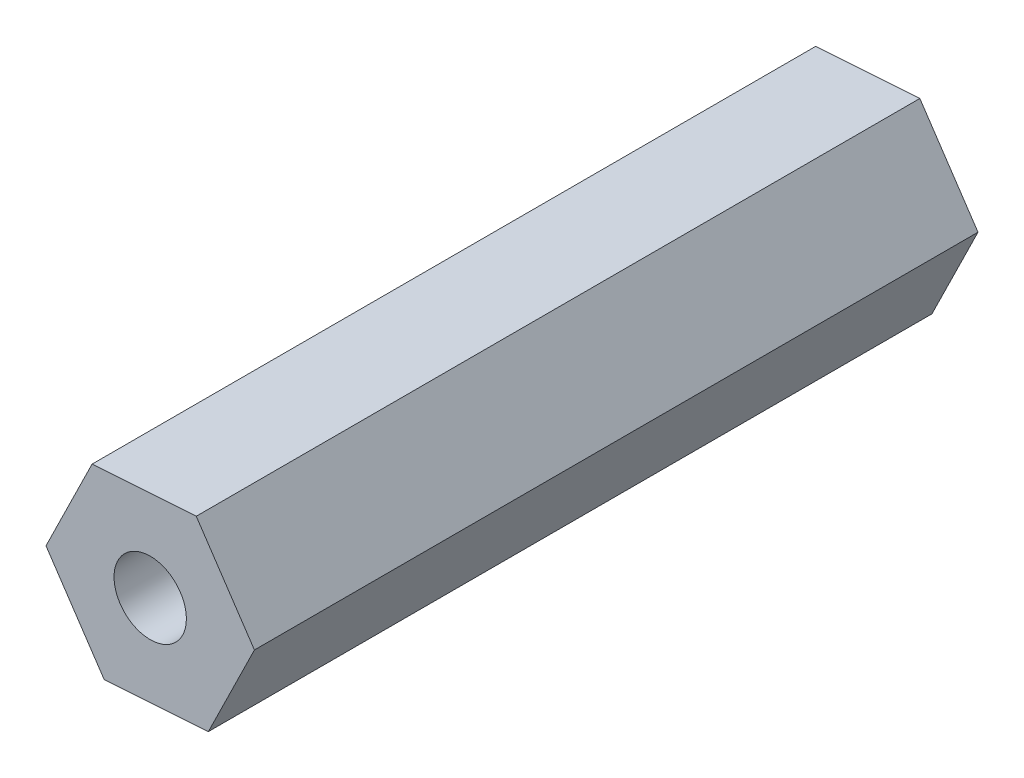
ISO-10303-21;
HEADER;
FILE_DESCRIPTION(('STEP AP214'),'2;1');
FILE_NAME('part.step','',(''),(''),'','','');
FILE_SCHEMA(('AUTOMOTIVE_DESIGN { 1 0 10303 214 1 1 1 1 }'));
ENDSEC;
DATA;
#1=APPLICATION_CONTEXT('core data for automotive mechanical design processes');
#2=APPLICATION_PROTOCOL_DEFINITION('international standard','automotive_design',2000,#1);
#3=PRODUCT_CONTEXT('',#1,'mechanical');
#4=PRODUCT('Part','Part','',(#3));
#5=PRODUCT_RELATED_PRODUCT_CATEGORY('part','',(#4));
#6=PRODUCT_DEFINITION_FORMATION('','',#4);
#7=PRODUCT_DEFINITION_CONTEXT('part definition',#1,'design');
#8=PRODUCT_DEFINITION('design','',#6,#7);
#9=PRODUCT_DEFINITION_SHAPE('','',#8);
#10=(LENGTH_UNIT() NAMED_UNIT(*) SI_UNIT(.MILLI.,.METRE.));
#11=(NAMED_UNIT(*) PLANE_ANGLE_UNIT() SI_UNIT($,.RADIAN.));
#12=(NAMED_UNIT(*) SI_UNIT($,.STERADIAN.) SOLID_ANGLE_UNIT());
#13=UNCERTAINTY_MEASURE_WITH_UNIT(LENGTH_MEASURE(1.E-05),#10,'distance_accuracy_value','');
#14=(GEOMETRIC_REPRESENTATION_CONTEXT(3) GLOBAL_UNCERTAINTY_ASSIGNED_CONTEXT((#13)) GLOBAL_UNIT_ASSIGNED_CONTEXT((#10,
#11,#12)) REPRESENTATION_CONTEXT('',''));
#15=CARTESIAN_POINT('',(0.,0.,0.));
#16=DIRECTION('',(0.,0.,1.));
#17=DIRECTION('',(1.,0.,0.));
#18=AXIS2_PLACEMENT_3D('',#15,#16,#17);
#19=CARTESIAN_POINT('',(0.,0.,50.8));
#20=DIRECTION('',(0.,0.,1.));
#21=DIRECTION('',(1.,0.,0.));
#22=AXIS2_PLACEMENT_3D('',#19,#20,#21);
#23=PLANE('',#22);
#24=DIRECTION('',(0.997756278935948,0.066950786730927,0.));
#25=VECTOR('',#24,1.);
#26=CARTESIAN_POINT('',(-3.23281084131473,-6.58120561885216,50.8));
#27=LINE('',#26,#25);
#28=CARTESIAN_POINT('',(-3.23281084131473,-6.58120561885216,50.8));
#29=VERTEX_POINT('',#28);
#30=CARTESIAN_POINT('',(4.0830858327975,-6.09029912363438,50.8));
#31=VERTEX_POINT('',#30);
#32=EDGE_CURVE('E133',#29,#31,#27,.T.);
#33=ORIENTED_EDGE('',*,*,#32,.T.);
#34=DIRECTION('',(0.440897057355637,0.897557677709427,0.));
#35=VECTOR('',#34,1.);
#36=CARTESIAN_POINT('',(4.0830858327975,-6.09029912363438,50.8));
#37=LINE('',#36,#35);
#38=CARTESIAN_POINT('',(7.31589667411222,0.490906495217786,50.8));
#39=VERTEX_POINT('',#38);
#40=EDGE_CURVE('E91',#31,#39,#37,.T.);
#41=ORIENTED_EDGE('',*,*,#40,.T.);
#42=DIRECTION('',(-0.556859221580311,0.8306068909785,0.));
#43=VECTOR('',#42,1.);
#44=CARTESIAN_POINT('',(7.31589667411222,0.490906495217786,50.8));
#45=LINE('',#44,#43);
#46=CARTESIAN_POINT('',(3.23281084131473,6.58120561885216,50.8));
#47=VERTEX_POINT('',#46);
#48=EDGE_CURVE('E104',#39,#47,#45,.T.);
#49=ORIENTED_EDGE('',*,*,#48,.T.);
#50=DIRECTION('',(-0.997756278935948,-0.066950786730927,0.));
#51=VECTOR('',#50,1.);
#52=CARTESIAN_POINT('',(3.23281084131473,6.58120561885216,50.8));
#53=LINE('',#52,#51);
#54=CARTESIAN_POINT('',(-4.0830858327975,6.09029912363437,50.8));
#55=VERTEX_POINT('',#54);
#56=EDGE_CURVE('E98',#47,#55,#53,.T.);
#57=ORIENTED_EDGE('',*,*,#56,.T.);
#58=DIRECTION('',(-0.440897057355637,-0.897557677709427,0.));
#59=VECTOR('',#58,1.);
#60=CARTESIAN_POINT('',(-4.0830858327975,6.09029912363437,50.8));
#61=LINE('',#60,#59);
#62=CARTESIAN_POINT('',(-7.31589667411223,-0.490906495217784,50.8));
#63=VERTEX_POINT('',#62);
#64=EDGE_CURVE('E102',#55,#63,#61,.T.);
#65=ORIENTED_EDGE('',*,*,#64,.T.);
#66=DIRECTION('',(0.556859221580311,-0.8306068909785,0.));
#67=VECTOR('',#66,1.);
#68=CARTESIAN_POINT('',(-7.31589667411223,-0.490906495217784,50.8));
#69=LINE('',#68,#67);
#70=EDGE_CURVE('E54',#63,#29,#69,.T.);
#71=ORIENTED_EDGE('',*,*,#70,.T.);
#72=EDGE_LOOP('',(#33,#41,#49,#57,#65,#71));
#73=FACE_BOUND('',#72,.T.);
#74=CARTESIAN_POINT('',(0.,0.,50.8));
#75=DIRECTION('',(0.,0.,1.));
#76=DIRECTION('',(1.,0.,0.));
#77=AXIS2_PLACEMENT_3D('',#74,#75,#76);
#78=CIRCLE('',#77,2.54);
#79=CARTESIAN_POINT('',(2.54,0.,50.8));
#80=VERTEX_POINT('',#79);
#81=EDGE_CURVE('E126',#80,#80,#78,.T.);
#82=ORIENTED_EDGE('',*,*,#81,.F.);
#83=EDGE_LOOP('',(#82));
#84=FACE_BOUND('',#83,.T.);
#85=ADVANCED_FACE('F37',(#73,#84),#23,.T.);
#86=CARTESIAN_POINT('',(0.,0.,0.));
#87=DIRECTION('',(0.,0.,1.));
#88=DIRECTION('',(1.,0.,0.));
#89=AXIS2_PLACEMENT_3D('',#86,#87,#88);
#90=PLANE('',#89);
#91=DIRECTION('',(0.997756278935948,0.066950786730927,0.));
#92=VECTOR('',#91,1.);
#93=CARTESIAN_POINT('',(-3.23281084131473,-6.58120561885216,0.));
#94=LINE('',#93,#92);
#95=CARTESIAN_POINT('',(-3.23281084131473,-6.58120561885216,0.));
#96=VERTEX_POINT('',#95);
#97=CARTESIAN_POINT('',(4.0830858327975,-6.09029912363438,0.));
#98=VERTEX_POINT('',#97);
#99=EDGE_CURVE('E122',#96,#98,#94,.T.);
#100=ORIENTED_EDGE('',*,*,#99,.F.);
#101=DIRECTION('',(0.556859221580311,-0.8306068909785,0.));
#102=VECTOR('',#101,1.);
#103=CARTESIAN_POINT('',(-7.31589667411223,-0.490906495217784,0.));
#104=LINE('',#103,#102);
#105=CARTESIAN_POINT('',(-7.31589667411223,-0.490906495217784,0.));
#106=VERTEX_POINT('',#105);
#107=EDGE_CURVE('E83',#106,#96,#104,.T.);
#108=ORIENTED_EDGE('',*,*,#107,.F.);
#109=DIRECTION('',(-0.440897057355637,-0.897557677709427,0.));
#110=VECTOR('',#109,1.);
#111=CARTESIAN_POINT('',(-4.0830858327975,6.09029912363437,0.));
#112=LINE('',#111,#110);
#113=CARTESIAN_POINT('',(-4.0830858327975,6.09029912363437,0.));
#114=VERTEX_POINT('',#113);
#115=EDGE_CURVE('E77',#114,#106,#112,.T.);
#116=ORIENTED_EDGE('',*,*,#115,.F.);
#117=DIRECTION('',(-0.997756278935948,-0.066950786730927,0.));
#118=VECTOR('',#117,1.);
#119=CARTESIAN_POINT('',(3.23281084131473,6.58120561885216,0.));
#120=LINE('',#119,#118);
#121=CARTESIAN_POINT('',(3.23281084131473,6.58120561885216,0.));
#122=VERTEX_POINT('',#121);
#123=EDGE_CURVE('E112',#122,#114,#120,.T.);
#124=ORIENTED_EDGE('',*,*,#123,.F.);
#125=DIRECTION('',(-0.556859221580311,0.8306068909785,0.));
#126=VECTOR('',#125,1.);
#127=CARTESIAN_POINT('',(7.31589667411222,0.490906495217786,0.));
#128=LINE('',#127,#126);
#129=CARTESIAN_POINT('',(7.31589667411222,0.490906495217786,0.));
#130=VERTEX_POINT('',#129);
#131=EDGE_CURVE('E128',#130,#122,#128,.T.);
#132=ORIENTED_EDGE('',*,*,#131,.F.);
#133=DIRECTION('',(0.440897057355637,0.897557677709427,0.));
#134=VECTOR('',#133,1.);
#135=CARTESIAN_POINT('',(4.0830858327975,-6.09029912363438,0.));
#136=LINE('',#135,#134);
#137=EDGE_CURVE('E125',#98,#130,#136,.T.);
#138=ORIENTED_EDGE('',*,*,#137,.F.);
#139=EDGE_LOOP('',(#100,#108,#116,#124,#132,#138));
#140=FACE_BOUND('',#139,.T.);
#141=CARTESIAN_POINT('',(0.,0.,0.));
#142=DIRECTION('',(0.,0.,1.));
#143=DIRECTION('',(1.,0.,0.));
#144=AXIS2_PLACEMENT_3D('',#141,#142,#143);
#145=CIRCLE('',#144,2.54);
#146=CARTESIAN_POINT('',(2.54,0.,0.));
#147=VERTEX_POINT('',#146);
#148=EDGE_CURVE('E244',#147,#147,#145,.T.);
#149=ORIENTED_EDGE('',*,*,#148,.T.);
#150=EDGE_LOOP('',(#149));
#151=FACE_BOUND('',#150,.T.);
#152=ADVANCED_FACE('F142',(#140,#151),#90,.F.);
#153=CARTESIAN_POINT('',(-3.23281084131473,-6.58120561885216,50.8));
#154=DIRECTION('',(-0.066950786730927,0.997756278935948,0.));
#155=DIRECTION('',(-0.997756278935948,-0.066950786730927,0.));
#156=AXIS2_PLACEMENT_3D('',#153,#154,#155);
#157=PLANE('',#156);
#158=ORIENTED_EDGE('',*,*,#99,.T.);
#159=DIRECTION('',(0.,0.,-1.));
#160=VECTOR('',#159,1.);
#161=CARTESIAN_POINT('',(4.0830858327975,-6.09029912363438,50.8));
#162=LINE('',#161,#160);
#163=EDGE_CURVE('E11',#31,#98,#162,.T.);
#164=ORIENTED_EDGE('',*,*,#163,.F.);
#165=ORIENTED_EDGE('',*,*,#32,.F.);
#166=DIRECTION('',(0.,0.,-1.));
#167=VECTOR('',#166,1.);
#168=CARTESIAN_POINT('',(-3.23281084131473,-6.58120561885216,50.8));
#169=LINE('',#168,#167);
#170=EDGE_CURVE('E118',#29,#96,#169,.T.);
#171=ORIENTED_EDGE('',*,*,#170,.T.);
#172=EDGE_LOOP('',(#158,#164,#165,#171));
#173=FACE_BOUND('',#172,.T.);
#174=ADVANCED_FACE('F39',(#173),#157,.F.);
#175=CARTESIAN_POINT('',(4.0830858327975,-6.09029912363438,50.8));
#176=DIRECTION('',(-0.897557677709427,0.440897057355637,0.));
#177=DIRECTION('',(-0.440897057355637,-0.897557677709427,0.));
#178=AXIS2_PLACEMENT_3D('',#175,#176,#177);
#179=PLANE('',#178);
#180=ORIENTED_EDGE('',*,*,#137,.T.);
#181=DIRECTION('',(0.,0.,-1.));
#182=VECTOR('',#181,1.);
#183=CARTESIAN_POINT('',(7.31589667411222,0.490906495217786,50.8));
#184=LINE('',#183,#182);
#185=EDGE_CURVE('E46',#39,#130,#184,.T.);
#186=ORIENTED_EDGE('',*,*,#185,.F.);
#187=ORIENTED_EDGE('',*,*,#40,.F.);
#188=ORIENTED_EDGE('',*,*,#163,.T.);
#189=EDGE_LOOP('',(#180,#186,#187,#188));
#190=FACE_BOUND('',#189,.T.);
#191=ADVANCED_FACE('F167',(#190),#179,.F.);
#192=CARTESIAN_POINT('',(7.31589667411222,0.490906495217786,50.8));
#193=DIRECTION('',(-0.8306068909785,-0.556859221580311,0.));
#194=DIRECTION('',(0.556859221580311,-0.8306068909785,0.));
#195=AXIS2_PLACEMENT_3D('',#192,#193,#194);
#196=PLANE('',#195);
#197=ORIENTED_EDGE('',*,*,#131,.T.);
#198=DIRECTION('',(0.,0.,-1.));
#199=VECTOR('',#198,1.);
#200=CARTESIAN_POINT('',(3.23281084131473,6.58120561885216,50.8));
#201=LINE('',#200,#199);
#202=EDGE_CURVE('E113',#47,#122,#201,.T.);
#203=ORIENTED_EDGE('',*,*,#202,.F.);
#204=ORIENTED_EDGE('',*,*,#48,.F.);
#205=ORIENTED_EDGE('',*,*,#185,.T.);
#206=EDGE_LOOP('',(#197,#203,#204,#205));
#207=FACE_BOUND('',#206,.T.);
#208=ADVANCED_FACE('F139',(#207),#196,.F.);
#209=CARTESIAN_POINT('',(3.23281084131473,6.58120561885216,50.8));
#210=DIRECTION('',(0.066950786730927,-0.997756278935948,0.));
#211=DIRECTION('',(0.997756278935948,0.066950786730927,0.));
#212=AXIS2_PLACEMENT_3D('',#209,#210,#211);
#213=PLANE('',#212);
#214=ORIENTED_EDGE('',*,*,#123,.T.);
#215=DIRECTION('',(0.,0.,-1.));
#216=VECTOR('',#215,1.);
#217=CARTESIAN_POINT('',(-4.0830858327975,6.09029912363437,50.8));
#218=LINE('',#217,#216);
#219=EDGE_CURVE('E109',#55,#114,#218,.T.);
#220=ORIENTED_EDGE('',*,*,#219,.F.);
#221=ORIENTED_EDGE('',*,*,#56,.F.);
#222=ORIENTED_EDGE('',*,*,#202,.T.);
#223=EDGE_LOOP('',(#214,#220,#221,#222));
#224=FACE_BOUND('',#223,.T.);
#225=ADVANCED_FACE('F110',(#224),#213,.F.);
#226=CARTESIAN_POINT('',(-4.0830858327975,6.09029912363437,50.8));
#227=DIRECTION('',(0.897557677709427,-0.440897057355637,0.));
#228=DIRECTION('',(0.440897057355637,0.897557677709427,0.));
#229=AXIS2_PLACEMENT_3D('',#226,#227,#228);
#230=PLANE('',#229);
#231=ORIENTED_EDGE('',*,*,#115,.T.);
#232=DIRECTION('',(0.,0.,-1.));
#233=VECTOR('',#232,1.);
#234=CARTESIAN_POINT('',(-7.31589667411223,-0.490906495217784,50.8));
#235=LINE('',#234,#233);
#236=EDGE_CURVE('E114',#63,#106,#235,.T.);
#237=ORIENTED_EDGE('',*,*,#236,.F.);
#238=ORIENTED_EDGE('',*,*,#64,.F.);
#239=ORIENTED_EDGE('',*,*,#219,.T.);
#240=EDGE_LOOP('',(#231,#237,#238,#239));
#241=FACE_BOUND('',#240,.T.);
#242=ADVANCED_FACE('F116',(#241),#230,.F.);
#243=CARTESIAN_POINT('',(-7.31589667411223,-0.490906495217784,50.8));
#244=DIRECTION('',(0.8306068909785,0.556859221580311,0.));
#245=DIRECTION('',(-0.556859221580311,0.8306068909785,0.));
#246=AXIS2_PLACEMENT_3D('',#243,#244,#245);
#247=PLANE('',#246);
#248=ORIENTED_EDGE('',*,*,#107,.T.);
#249=ORIENTED_EDGE('',*,*,#170,.F.);
#250=ORIENTED_EDGE('',*,*,#70,.F.);
#251=ORIENTED_EDGE('',*,*,#236,.T.);
#252=EDGE_LOOP('',(#248,#249,#250,#251));
#253=FACE_BOUND('',#252,.T.);
#254=ADVANCED_FACE('F147',(#253),#247,.F.);
#255=CARTESIAN_POINT('',(0.,0.,50.8));
#256=DIRECTION('',(0.,0.,-1.));
#257=DIRECTION('',(-1.,0.,0.));
#258=AXIS2_PLACEMENT_3D('',#255,#256,#257);
#259=CYLINDRICAL_SURFACE('',#258,2.54);
#260=ORIENTED_EDGE('',*,*,#81,.T.);
#261=EDGE_LOOP('',(#260));
#262=FACE_BOUND('',#261,.T.);
#263=ORIENTED_EDGE('',*,*,#148,.F.);
#264=EDGE_LOOP('',(#263));
#265=FACE_BOUND('',#264,.T.);
#266=ADVANCED_FACE('F149',(#262,#265),#259,.F.);
#267=CLOSED_SHELL('',(#85,#152,#174,#191,#208,#225,#242,#254,#266));
#268=MANIFOLD_SOLID_BREP('B2',#267);
#269=ADVANCED_BREP_SHAPE_REPRESENTATION('',(#18,#268),#14);
#270=SHAPE_DEFINITION_REPRESENTATION(#9,#269);
ENDSEC;
END-ISO-10303-21;
